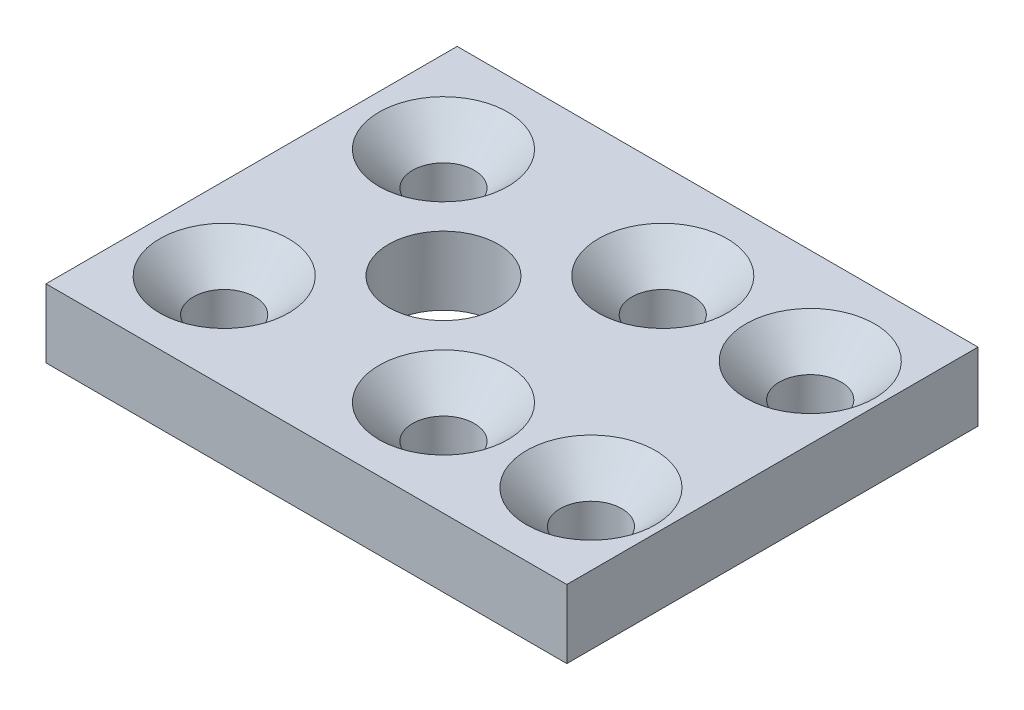
ISO-10303-21;
HEADER;
FILE_DESCRIPTION(('STEP AP214'),'2;1');
FILE_NAME('part.step','',(''),(''),'','','');
FILE_SCHEMA(('AUTOMOTIVE_DESIGN { 1 0 10303 214 1 1 1 1 }'));
ENDSEC;
DATA;
#1=APPLICATION_CONTEXT('core data for automotive mechanical design processes');
#2=APPLICATION_PROTOCOL_DEFINITION('international standard','automotive_design',2000,#1);
#3=PRODUCT_CONTEXT('',#1,'mechanical');
#4=PRODUCT('Part','Part','',(#3));
#5=PRODUCT_RELATED_PRODUCT_CATEGORY('part','',(#4));
#6=PRODUCT_DEFINITION_FORMATION('','',#4);
#7=PRODUCT_DEFINITION_CONTEXT('part definition',#1,'design');
#8=PRODUCT_DEFINITION('design','',#6,#7);
#9=PRODUCT_DEFINITION_SHAPE('','',#8);
#10=(LENGTH_UNIT() NAMED_UNIT(*) SI_UNIT(.MILLI.,.METRE.));
#11=(NAMED_UNIT(*) PLANE_ANGLE_UNIT() SI_UNIT($,.RADIAN.));
#12=(NAMED_UNIT(*) SI_UNIT($,.STERADIAN.) SOLID_ANGLE_UNIT());
#13=UNCERTAINTY_MEASURE_WITH_UNIT(LENGTH_MEASURE(1.E-05),#10,'distance_accuracy_value','');
#14=(GEOMETRIC_REPRESENTATION_CONTEXT(3) GLOBAL_UNCERTAINTY_ASSIGNED_CONTEXT((#13)) GLOBAL_UNIT_ASSIGNED_CONTEXT((#10,
#11,#12)) REPRESENTATION_CONTEXT('',''));
#15=CARTESIAN_POINT('',(0.,0.,0.));
#16=DIRECTION('',(0.,0.,1.));
#17=DIRECTION('',(1.,0.,0.));
#18=AXIS2_PLACEMENT_3D('',#15,#16,#17);
#19=CARTESIAN_POINT('',(19.,5.,15.));
#20=DIRECTION('',(-1.,0.,0.));
#21=DIRECTION('',(0.,0.,1.));
#22=AXIS2_PLACEMENT_3D('',#19,#20,#21);
#23=PLANE('',#22);
#24=DIRECTION('',(0.,0.,-1.));
#25=VECTOR('',#24,1.);
#26=CARTESIAN_POINT('',(19.,0.,15.));
#27=LINE('',#26,#25);
#28=CARTESIAN_POINT('',(19.,0.,15.));
#29=VERTEX_POINT('',#28);
#30=CARTESIAN_POINT('',(19.,0.,-15.));
#31=VERTEX_POINT('',#30);
#32=EDGE_CURVE('E95',#29,#31,#27,.T.);
#33=ORIENTED_EDGE('',*,*,#32,.T.);
#34=DIRECTION('',(0.,-1.,0.));
#35=VECTOR('',#34,1.);
#36=CARTESIAN_POINT('',(19.,5.,-15.));
#37=LINE('',#36,#35);
#38=CARTESIAN_POINT('',(19.,5.,-15.));
#39=VERTEX_POINT('',#38);
#40=EDGE_CURVE('E11',#39,#31,#37,.T.);
#41=ORIENTED_EDGE('',*,*,#40,.F.);
#42=DIRECTION('',(0.,0.,-1.));
#43=VECTOR('',#42,1.);
#44=CARTESIAN_POINT('',(19.,5.,15.));
#45=LINE('',#44,#43);
#46=CARTESIAN_POINT('',(19.,5.,15.));
#47=VERTEX_POINT('',#46);
#48=EDGE_CURVE('E83',#47,#39,#45,.T.);
#49=ORIENTED_EDGE('',*,*,#48,.F.);
#50=DIRECTION('',(0.,-1.,0.));
#51=VECTOR('',#50,1.);
#52=CARTESIAN_POINT('',(19.,5.,15.));
#53=LINE('',#52,#51);
#54=EDGE_CURVE('E91',#47,#29,#53,.T.);
#55=ORIENTED_EDGE('',*,*,#54,.T.);
#56=EDGE_LOOP('',(#33,#41,#49,#55));
#57=FACE_BOUND('',#56,.T.);
#58=ADVANCED_FACE('F32',(#57),#23,.F.);
#59=CARTESIAN_POINT('',(-19.,5.,-15.));
#60=DIRECTION('',(0.,0.,1.));
#61=DIRECTION('',(1.,0.,0.));
#62=AXIS2_PLACEMENT_3D('',#59,#60,#61);
#63=PLANE('',#62);
#64=DIRECTION('',(-1.,0.,0.));
#65=VECTOR('',#64,1.);
#66=CARTESIAN_POINT('',(-19.,0.,-15.));
#67=LINE('',#66,#65);
#68=CARTESIAN_POINT('',(-19.,0.,-15.));
#69=VERTEX_POINT('',#68);
#70=EDGE_CURVE('E87',#31,#69,#67,.T.);
#71=ORIENTED_EDGE('',*,*,#70,.T.);
#72=DIRECTION('',(0.,-1.,0.));
#73=VECTOR('',#72,1.);
#74=CARTESIAN_POINT('',(-19.,5.,-15.));
#75=LINE('',#74,#73);
#76=CARTESIAN_POINT('',(-19.,5.,-15.));
#77=VERTEX_POINT('',#76);
#78=EDGE_CURVE('E40',#77,#69,#75,.T.);
#79=ORIENTED_EDGE('',*,*,#78,.F.);
#80=DIRECTION('',(-1.,0.,0.));
#81=VECTOR('',#80,1.);
#82=CARTESIAN_POINT('',(-19.,5.,-15.));
#83=LINE('',#82,#81);
#84=EDGE_CURVE('E78',#39,#77,#83,.T.);
#85=ORIENTED_EDGE('',*,*,#84,.F.);
#86=ORIENTED_EDGE('',*,*,#40,.T.);
#87=EDGE_LOOP('',(#71,#79,#85,#86));
#88=FACE_BOUND('',#87,.T.);
#89=ADVANCED_FACE('F86',(#88),#63,.F.);
#90=CARTESIAN_POINT('',(-19.,5.,15.));
#91=DIRECTION('',(1.,0.,0.));
#92=DIRECTION('',(0.,0.,-1.));
#93=AXIS2_PLACEMENT_3D('',#90,#91,#92);
#94=PLANE('',#93);
#95=DIRECTION('',(0.,0.,1.));
#96=VECTOR('',#95,1.);
#97=CARTESIAN_POINT('',(-19.,0.,15.));
#98=LINE('',#97,#96);
#99=CARTESIAN_POINT('',(-19.,0.,15.));
#100=VERTEX_POINT('',#99);
#101=EDGE_CURVE('E65',#69,#100,#98,.T.);
#102=ORIENTED_EDGE('',*,*,#101,.T.);
#103=DIRECTION('',(0.,-1.,0.));
#104=VECTOR('',#103,1.);
#105=CARTESIAN_POINT('',(-19.,5.,15.));
#106=LINE('',#105,#104);
#107=CARTESIAN_POINT('',(-19.,5.,15.));
#108=VERTEX_POINT('',#107);
#109=EDGE_CURVE('E88',#108,#100,#106,.T.);
#110=ORIENTED_EDGE('',*,*,#109,.F.);
#111=DIRECTION('',(0.,0.,1.));
#112=VECTOR('',#111,1.);
#113=CARTESIAN_POINT('',(-19.,5.,15.));
#114=LINE('',#113,#112);
#115=EDGE_CURVE('E81',#77,#108,#114,.T.);
#116=ORIENTED_EDGE('',*,*,#115,.F.);
#117=ORIENTED_EDGE('',*,*,#78,.T.);
#118=EDGE_LOOP('',(#102,#110,#116,#117));
#119=FACE_BOUND('',#118,.T.);
#120=ADVANCED_FACE('F89',(#119),#94,.F.);
#121=CARTESIAN_POINT('',(-19.,5.,15.));
#122=DIRECTION('',(0.,0.,-1.));
#123=DIRECTION('',(-1.,0.,0.));
#124=AXIS2_PLACEMENT_3D('',#121,#122,#123);
#125=PLANE('',#124);
#126=DIRECTION('',(1.,0.,0.));
#127=VECTOR('',#126,1.);
#128=CARTESIAN_POINT('',(-19.,0.,15.));
#129=LINE('',#128,#127);
#130=EDGE_CURVE('E71',#100,#29,#129,.T.);
#131=ORIENTED_EDGE('',*,*,#130,.T.);
#132=ORIENTED_EDGE('',*,*,#54,.F.);
#133=DIRECTION('',(1.,0.,0.));
#134=VECTOR('',#133,1.);
#135=CARTESIAN_POINT('',(-19.,5.,15.));
#136=LINE('',#135,#134);
#137=EDGE_CURVE('E48',#108,#47,#136,.T.);
#138=ORIENTED_EDGE('',*,*,#137,.F.);
#139=ORIENTED_EDGE('',*,*,#109,.T.);
#140=EDGE_LOOP('',(#131,#132,#138,#139));
#141=FACE_BOUND('',#140,.T.);
#142=ADVANCED_FACE('F103',(#141),#125,.F.);
#143=CARTESIAN_POINT('',(0.,5.,0.));
#144=DIRECTION('',(0.,-1.,0.));
#145=DIRECTION('',(0.,0.,-1.));
#146=AXIS2_PLACEMENT_3D('',#143,#144,#145);
#147=PLANE('',#146);
#148=CARTESIAN_POINT('',(-5.,5.,0.));
#149=DIRECTION('',(0.,1.,0.));
#150=DIRECTION('',(0.,0.,1.));
#151=AXIS2_PLACEMENT_3D('',#148,#149,#150);
#152=CIRCLE('',#151,4.);
#153=CARTESIAN_POINT('',(-5.,5.,4.));
#154=VERTEX_POINT('',#153);
#155=EDGE_CURVE('E165',#154,#154,#152,.T.);
#156=ORIENTED_EDGE('',*,*,#155,.F.);
#157=EDGE_LOOP('',(#156));
#158=FACE_BOUND('',#157,.T.);
#159=CARTESIAN_POINT('',(-13.,5.,-8.));
#160=DIRECTION('',(0.,1.,0.));
#161=DIRECTION('',(0.,0.,1.));
#162=AXIS2_PLACEMENT_3D('',#159,#160,#161);
#163=CIRCLE('',#162,4.7);
#164=CARTESIAN_POINT('',(-13.,5.,-3.3));
#165=VERTEX_POINT('',#164);
#166=EDGE_CURVE('E159',#165,#165,#163,.T.);
#167=ORIENTED_EDGE('',*,*,#166,.F.);
#168=EDGE_LOOP('',(#167));
#169=FACE_BOUND('',#168,.T.);
#170=CARTESIAN_POINT('',(3.,5.,-8.));
#171=DIRECTION('',(0.,1.,0.));
#172=DIRECTION('',(0.,0.,1.));
#173=AXIS2_PLACEMENT_3D('',#170,#171,#172);
#174=CIRCLE('',#173,4.7);
#175=CARTESIAN_POINT('',(3.,5.,-3.3));
#176=VERTEX_POINT('',#175);
#177=EDGE_CURVE('E150',#176,#176,#174,.T.);
#178=ORIENTED_EDGE('',*,*,#177,.F.);
#179=EDGE_LOOP('',(#178));
#180=FACE_BOUND('',#179,.T.);
#181=CARTESIAN_POINT('',(3.,5.,8.));
#182=DIRECTION('',(0.,1.,0.));
#183=DIRECTION('',(0.,0.,1.));
#184=AXIS2_PLACEMENT_3D('',#181,#182,#183);
#185=CIRCLE('',#184,4.7);
#186=CARTESIAN_POINT('',(3.,5.,12.7));
#187=VERTEX_POINT('',#186);
#188=EDGE_CURVE('E141',#187,#187,#185,.T.);
#189=ORIENTED_EDGE('',*,*,#188,.F.);
#190=EDGE_LOOP('',(#189));
#191=FACE_BOUND('',#190,.T.);
#192=CARTESIAN_POINT('',(-13.,5.,8.));
#193=DIRECTION('',(0.,1.,0.));
#194=DIRECTION('',(0.,0.,1.));
#195=AXIS2_PLACEMENT_3D('',#192,#193,#194);
#196=CIRCLE('',#195,4.7);
#197=CARTESIAN_POINT('',(-13.,5.,12.7));
#198=VERTEX_POINT('',#197);
#199=EDGE_CURVE('E132',#198,#198,#196,.T.);
#200=ORIENTED_EDGE('',*,*,#199,.F.);
#201=EDGE_LOOP('',(#200));
#202=FACE_BOUND('',#201,.T.);
#203=CARTESIAN_POINT('',(13.76,5.,-8.));
#204=DIRECTION('',(0.,1.,0.));
#205=DIRECTION('',(0.,0.,1.));
#206=AXIS2_PLACEMENT_3D('',#203,#204,#205);
#207=CIRCLE('',#206,4.7);
#208=CARTESIAN_POINT('',(13.76,5.,-3.3));
#209=VERTEX_POINT('',#208);
#210=EDGE_CURVE('E123',#209,#209,#207,.T.);
#211=ORIENTED_EDGE('',*,*,#210,.F.);
#212=EDGE_LOOP('',(#211));
#213=FACE_BOUND('',#212,.T.);
#214=CARTESIAN_POINT('',(13.76,5.,8.));
#215=DIRECTION('',(0.,1.,0.));
#216=DIRECTION('',(0.,0.,1.));
#217=AXIS2_PLACEMENT_3D('',#214,#215,#216);
#218=CIRCLE('',#217,4.7);
#219=CARTESIAN_POINT('',(13.76,5.,12.7));
#220=VERTEX_POINT('',#219);
#221=EDGE_CURVE('E114',#220,#220,#218,.T.);
#222=ORIENTED_EDGE('',*,*,#221,.F.);
#223=EDGE_LOOP('',(#222));
#224=FACE_BOUND('',#223,.T.);
#225=ORIENTED_EDGE('',*,*,#48,.T.);
#226=ORIENTED_EDGE('',*,*,#84,.T.);
#227=ORIENTED_EDGE('',*,*,#115,.T.);
#228=ORIENTED_EDGE('',*,*,#137,.T.);
#229=EDGE_LOOP('',(#225,#226,#227,#228));
#230=FACE_BOUND('',#229,.T.);
#231=ADVANCED_FACE('F79',(#158,#169,#180,#191,#202,#213,#224,#230),#147,.F.);
#232=CARTESIAN_POINT('',(0.,0.,0.));
#233=DIRECTION('',(0.,-1.,0.));
#234=DIRECTION('',(0.,0.,-1.));
#235=AXIS2_PLACEMENT_3D('',#232,#233,#234);
#236=PLANE('',#235);
#237=CARTESIAN_POINT('',(-5.,0.,0.));
#238=DIRECTION('',(0.,-1.,0.));
#239=DIRECTION('',(0.,0.,-1.));
#240=AXIS2_PLACEMENT_3D('',#237,#238,#239);
#241=CIRCLE('',#240,4.);
#242=CARTESIAN_POINT('',(-5.,0.,-4.));
#243=VERTEX_POINT('',#242);
#244=EDGE_CURVE('E162',#243,#243,#241,.T.);
#245=ORIENTED_EDGE('',*,*,#244,.F.);
#246=EDGE_LOOP('',(#245));
#247=FACE_BOUND('',#246,.T.);
#248=CARTESIAN_POINT('',(-13.,0.,-8.));
#249=DIRECTION('',(0.,-1.,0.));
#250=DIRECTION('',(0.,0.,-1.));
#251=AXIS2_PLACEMENT_3D('',#248,#249,#250);
#252=CIRCLE('',#251,2.25);
#253=CARTESIAN_POINT('',(-13.,0.,-10.25));
#254=VERTEX_POINT('',#253);
#255=EDGE_CURVE('E153',#254,#254,#252,.T.);
#256=ORIENTED_EDGE('',*,*,#255,.F.);
#257=EDGE_LOOP('',(#256));
#258=FACE_BOUND('',#257,.T.);
#259=CARTESIAN_POINT('',(3.,0.,-8.));
#260=DIRECTION('',(0.,-1.,0.));
#261=DIRECTION('',(0.,0.,-1.));
#262=AXIS2_PLACEMENT_3D('',#259,#260,#261);
#263=CIRCLE('',#262,2.25);
#264=CARTESIAN_POINT('',(3.,0.,-10.25));
#265=VERTEX_POINT('',#264);
#266=EDGE_CURVE('E144',#265,#265,#263,.T.);
#267=ORIENTED_EDGE('',*,*,#266,.F.);
#268=EDGE_LOOP('',(#267));
#269=FACE_BOUND('',#268,.T.);
#270=CARTESIAN_POINT('',(3.,0.,8.));
#271=DIRECTION('',(0.,-1.,0.));
#272=DIRECTION('',(0.,0.,-1.));
#273=AXIS2_PLACEMENT_3D('',#270,#271,#272);
#274=CIRCLE('',#273,2.25);
#275=CARTESIAN_POINT('',(3.,0.,5.75));
#276=VERTEX_POINT('',#275);
#277=EDGE_CURVE('E135',#276,#276,#274,.T.);
#278=ORIENTED_EDGE('',*,*,#277,.F.);
#279=EDGE_LOOP('',(#278));
#280=FACE_BOUND('',#279,.T.);
#281=CARTESIAN_POINT('',(-13.,0.,8.));
#282=DIRECTION('',(0.,-1.,0.));
#283=DIRECTION('',(0.,0.,-1.));
#284=AXIS2_PLACEMENT_3D('',#281,#282,#283);
#285=CIRCLE('',#284,2.25);
#286=CARTESIAN_POINT('',(-13.,0.,5.75));
#287=VERTEX_POINT('',#286);
#288=EDGE_CURVE('E126',#287,#287,#285,.T.);
#289=ORIENTED_EDGE('',*,*,#288,.F.);
#290=EDGE_LOOP('',(#289));
#291=FACE_BOUND('',#290,.T.);
#292=CARTESIAN_POINT('',(13.76,0.,-8.));
#293=DIRECTION('',(0.,-1.,0.));
#294=DIRECTION('',(0.,0.,-1.));
#295=AXIS2_PLACEMENT_3D('',#292,#293,#294);
#296=CIRCLE('',#295,2.25);
#297=CARTESIAN_POINT('',(13.76,0.,-10.25));
#298=VERTEX_POINT('',#297);
#299=EDGE_CURVE('E117',#298,#298,#296,.T.);
#300=ORIENTED_EDGE('',*,*,#299,.F.);
#301=EDGE_LOOP('',(#300));
#302=FACE_BOUND('',#301,.T.);
#303=CARTESIAN_POINT('',(13.76,0.,8.));
#304=DIRECTION('',(0.,-1.,0.));
#305=DIRECTION('',(0.,0.,-1.));
#306=AXIS2_PLACEMENT_3D('',#303,#304,#305);
#307=CIRCLE('',#306,2.25);
#308=CARTESIAN_POINT('',(13.76,0.,5.75));
#309=VERTEX_POINT('',#308);
#310=EDGE_CURVE('E98',#309,#309,#307,.T.);
#311=ORIENTED_EDGE('',*,*,#310,.F.);
#312=EDGE_LOOP('',(#311));
#313=FACE_BOUND('',#312,.T.);
#314=ORIENTED_EDGE('',*,*,#32,.F.);
#315=ORIENTED_EDGE('',*,*,#130,.F.);
#316=ORIENTED_EDGE('',*,*,#101,.F.);
#317=ORIENTED_EDGE('',*,*,#70,.F.);
#318=EDGE_LOOP('',(#314,#315,#316,#317));
#319=FACE_BOUND('',#318,.T.);
#320=ADVANCED_FACE('F106',(#247,#258,#269,#280,#291,#302,#313,#319),#236,.T.);
#321=CARTESIAN_POINT('',(13.76,5.,8.));
#322=DIRECTION('',(0.,1.,0.));
#323=DIRECTION('',(0.,0.,1.));
#324=AXIS2_PLACEMENT_3D('',#321,#322,#323);
#325=CYLINDRICAL_SURFACE('',#324,2.25);
#326=CARTESIAN_POINT('',(13.76,2.55,8.));
#327=DIRECTION('',(0.,1.,0.));
#328=DIRECTION('',(0.,0.,1.));
#329=AXIS2_PLACEMENT_3D('',#326,#327,#328);
#330=CIRCLE('',#329,2.25);
#331=CARTESIAN_POINT('',(13.76,2.55,10.25));
#332=VERTEX_POINT('',#331);
#333=EDGE_CURVE('E111',#332,#332,#330,.T.);
#334=ORIENTED_EDGE('',*,*,#333,.T.);
#335=EDGE_LOOP('',(#334));
#336=FACE_BOUND('',#335,.T.);
#337=ORIENTED_EDGE('',*,*,#310,.T.);
#338=EDGE_LOOP('',(#337));
#339=FACE_BOUND('',#338,.T.);
#340=ADVANCED_FACE('F190',(#336,#339),#325,.F.);
#341=CARTESIAN_POINT('',(13.76,5.,8.));
#342=DIRECTION('',(0.,1.,0.));
#343=DIRECTION('',(0.,0.,1.));
#344=AXIS2_PLACEMENT_3D('',#341,#342,#343);
#345=CONICAL_SURFACE('',#344,4.7,0.785398163397448);
#346=ORIENTED_EDGE('',*,*,#333,.F.);
#347=EDGE_LOOP('',(#346));
#348=FACE_BOUND('',#347,.T.);
#349=ORIENTED_EDGE('',*,*,#221,.T.);
#350=EDGE_LOOP('',(#349));
#351=FACE_BOUND('',#350,.T.);
#352=ADVANCED_FACE('F187',(#348,#351),#345,.F.);
#353=CARTESIAN_POINT('',(13.76,5.,-8.));
#354=DIRECTION('',(0.,1.,0.));
#355=DIRECTION('',(0.,0.,1.));
#356=AXIS2_PLACEMENT_3D('',#353,#354,#355);
#357=CYLINDRICAL_SURFACE('',#356,2.25);
#358=CARTESIAN_POINT('',(13.76,2.55,-8.));
#359=DIRECTION('',(0.,1.,0.));
#360=DIRECTION('',(0.,0.,1.));
#361=AXIS2_PLACEMENT_3D('',#358,#359,#360);
#362=CIRCLE('',#361,2.25);
#363=CARTESIAN_POINT('',(13.76,2.55,-5.75));
#364=VERTEX_POINT('',#363);
#365=EDGE_CURVE('E120',#364,#364,#362,.T.);
#366=ORIENTED_EDGE('',*,*,#365,.T.);
#367=EDGE_LOOP('',(#366));
#368=FACE_BOUND('',#367,.T.);
#369=ORIENTED_EDGE('',*,*,#299,.T.);
#370=EDGE_LOOP('',(#369));
#371=FACE_BOUND('',#370,.T.);
#372=ADVANCED_FACE('F189',(#368,#371),#357,.F.);
#373=CARTESIAN_POINT('',(13.76,5.,-8.));
#374=DIRECTION('',(0.,1.,0.));
#375=DIRECTION('',(0.,0.,1.));
#376=AXIS2_PLACEMENT_3D('',#373,#374,#375);
#377=CONICAL_SURFACE('',#376,4.7,0.785398163397448);
#378=ORIENTED_EDGE('',*,*,#365,.F.);
#379=EDGE_LOOP('',(#378));
#380=FACE_BOUND('',#379,.T.);
#381=ORIENTED_EDGE('',*,*,#210,.T.);
#382=EDGE_LOOP('',(#381));
#383=FACE_BOUND('',#382,.T.);
#384=ADVANCED_FACE('F197',(#380,#383),#377,.F.);
#385=CARTESIAN_POINT('',(-13.,5.,8.));
#386=DIRECTION('',(0.,1.,0.));
#387=DIRECTION('',(0.,0.,1.));
#388=AXIS2_PLACEMENT_3D('',#385,#386,#387);
#389=CYLINDRICAL_SURFACE('',#388,2.25);
#390=CARTESIAN_POINT('',(-13.,2.55,8.));
#391=DIRECTION('',(0.,1.,0.));
#392=DIRECTION('',(0.,0.,1.));
#393=AXIS2_PLACEMENT_3D('',#390,#391,#392);
#394=CIRCLE('',#393,2.25);
#395=CARTESIAN_POINT('',(-13.,2.55,10.25));
#396=VERTEX_POINT('',#395);
#397=EDGE_CURVE('E129',#396,#396,#394,.T.);
#398=ORIENTED_EDGE('',*,*,#397,.T.);
#399=EDGE_LOOP('',(#398));
#400=FACE_BOUND('',#399,.T.);
#401=ORIENTED_EDGE('',*,*,#288,.T.);
#402=EDGE_LOOP('',(#401));
#403=FACE_BOUND('',#402,.T.);
#404=ADVANCED_FACE('F234',(#400,#403),#389,.F.);
#405=CARTESIAN_POINT('',(-13.,5.,8.));
#406=DIRECTION('',(0.,1.,0.));
#407=DIRECTION('',(0.,0.,1.));
#408=AXIS2_PLACEMENT_3D('',#405,#406,#407);
#409=CONICAL_SURFACE('',#408,4.7,0.785398163397448);
#410=ORIENTED_EDGE('',*,*,#397,.F.);
#411=EDGE_LOOP('',(#410));
#412=FACE_BOUND('',#411,.T.);
#413=ORIENTED_EDGE('',*,*,#199,.T.);
#414=EDGE_LOOP('',(#413));
#415=FACE_BOUND('',#414,.T.);
#416=ADVANCED_FACE('F236',(#412,#415),#409,.F.);
#417=CARTESIAN_POINT('',(3.,5.,8.));
#418=DIRECTION('',(0.,1.,0.));
#419=DIRECTION('',(0.,0.,1.));
#420=AXIS2_PLACEMENT_3D('',#417,#418,#419);
#421=CYLINDRICAL_SURFACE('',#420,2.25);
#422=CARTESIAN_POINT('',(3.,2.55,8.));
#423=DIRECTION('',(0.,1.,0.));
#424=DIRECTION('',(0.,0.,1.));
#425=AXIS2_PLACEMENT_3D('',#422,#423,#424);
#426=CIRCLE('',#425,2.25);
#427=CARTESIAN_POINT('',(3.,2.55,10.25));
#428=VERTEX_POINT('',#427);
#429=EDGE_CURVE('E138',#428,#428,#426,.T.);
#430=ORIENTED_EDGE('',*,*,#429,.T.);
#431=EDGE_LOOP('',(#430));
#432=FACE_BOUND('',#431,.T.);
#433=ORIENTED_EDGE('',*,*,#277,.T.);
#434=EDGE_LOOP('',(#433));
#435=FACE_BOUND('',#434,.T.);
#436=ADVANCED_FACE('F243',(#432,#435),#421,.F.);
#437=CARTESIAN_POINT('',(3.,5.,8.));
#438=DIRECTION('',(0.,1.,0.));
#439=DIRECTION('',(0.,0.,1.));
#440=AXIS2_PLACEMENT_3D('',#437,#438,#439);
#441=CONICAL_SURFACE('',#440,4.7,0.785398163397448);
#442=ORIENTED_EDGE('',*,*,#429,.F.);
#443=EDGE_LOOP('',(#442));
#444=FACE_BOUND('',#443,.T.);
#445=ORIENTED_EDGE('',*,*,#188,.T.);
#446=EDGE_LOOP('',(#445));
#447=FACE_BOUND('',#446,.T.);
#448=ADVANCED_FACE('F251',(#444,#447),#441,.F.);
#449=CARTESIAN_POINT('',(3.,5.,-8.));
#450=DIRECTION('',(0.,1.,0.));
#451=DIRECTION('',(0.,0.,1.));
#452=AXIS2_PLACEMENT_3D('',#449,#450,#451);
#453=CYLINDRICAL_SURFACE('',#452,2.25);
#454=CARTESIAN_POINT('',(3.,2.55,-8.));
#455=DIRECTION('',(0.,1.,0.));
#456=DIRECTION('',(0.,0.,1.));
#457=AXIS2_PLACEMENT_3D('',#454,#455,#456);
#458=CIRCLE('',#457,2.25);
#459=CARTESIAN_POINT('',(3.,2.55,-5.75));
#460=VERTEX_POINT('',#459);
#461=EDGE_CURVE('E147',#460,#460,#458,.T.);
#462=ORIENTED_EDGE('',*,*,#461,.T.);
#463=EDGE_LOOP('',(#462));
#464=FACE_BOUND('',#463,.T.);
#465=ORIENTED_EDGE('',*,*,#266,.T.);
#466=EDGE_LOOP('',(#465));
#467=FACE_BOUND('',#466,.T.);
#468=ADVANCED_FACE('F255',(#464,#467),#453,.F.);
#469=CARTESIAN_POINT('',(3.,5.,-8.));
#470=DIRECTION('',(0.,1.,0.));
#471=DIRECTION('',(0.,0.,1.));
#472=AXIS2_PLACEMENT_3D('',#469,#470,#471);
#473=CONICAL_SURFACE('',#472,4.7,0.785398163397448);
#474=ORIENTED_EDGE('',*,*,#461,.F.);
#475=EDGE_LOOP('',(#474));
#476=FACE_BOUND('',#475,.T.);
#477=ORIENTED_EDGE('',*,*,#177,.T.);
#478=EDGE_LOOP('',(#477));
#479=FACE_BOUND('',#478,.T.);
#480=ADVANCED_FACE('F259',(#476,#479),#473,.F.);
#481=CARTESIAN_POINT('',(-13.,5.,-8.));
#482=DIRECTION('',(0.,1.,0.));
#483=DIRECTION('',(0.,0.,1.));
#484=AXIS2_PLACEMENT_3D('',#481,#482,#483);
#485=CYLINDRICAL_SURFACE('',#484,2.25);
#486=CARTESIAN_POINT('',(-13.,2.55,-8.));
#487=DIRECTION('',(0.,1.,0.));
#488=DIRECTION('',(0.,0.,1.));
#489=AXIS2_PLACEMENT_3D('',#486,#487,#488);
#490=CIRCLE('',#489,2.25);
#491=CARTESIAN_POINT('',(-13.,2.55,-5.75));
#492=VERTEX_POINT('',#491);
#493=EDGE_CURVE('E156',#492,#492,#490,.T.);
#494=ORIENTED_EDGE('',*,*,#493,.T.);
#495=EDGE_LOOP('',(#494));
#496=FACE_BOUND('',#495,.T.);
#497=ORIENTED_EDGE('',*,*,#255,.T.);
#498=EDGE_LOOP('',(#497));
#499=FACE_BOUND('',#498,.T.);
#500=ADVANCED_FACE('F263',(#496,#499),#485,.F.);
#501=CARTESIAN_POINT('',(-13.,5.,-8.));
#502=DIRECTION('',(0.,1.,0.));
#503=DIRECTION('',(0.,0.,1.));
#504=AXIS2_PLACEMENT_3D('',#501,#502,#503);
#505=CONICAL_SURFACE('',#504,4.7,0.785398163397448);
#506=ORIENTED_EDGE('',*,*,#493,.F.);
#507=EDGE_LOOP('',(#506));
#508=FACE_BOUND('',#507,.T.);
#509=ORIENTED_EDGE('',*,*,#166,.T.);
#510=EDGE_LOOP('',(#509));
#511=FACE_BOUND('',#510,.T.);
#512=ADVANCED_FACE('F267',(#508,#511),#505,.F.);
#513=CARTESIAN_POINT('',(-5.,5.,0.));
#514=DIRECTION('',(0.,1.,0.));
#515=DIRECTION('',(0.,0.,1.));
#516=AXIS2_PLACEMENT_3D('',#513,#514,#515);
#517=CYLINDRICAL_SURFACE('',#516,4.);
#518=ORIENTED_EDGE('',*,*,#155,.T.);
#519=EDGE_LOOP('',(#518));
#520=FACE_BOUND('',#519,.T.);
#521=ORIENTED_EDGE('',*,*,#244,.T.);
#522=EDGE_LOOP('',(#521));
#523=FACE_BOUND('',#522,.T.);
#524=ADVANCED_FACE('F169',(#520,#523),#517,.F.);
#525=CLOSED_SHELL('',(#58,#89,#120,#142,#231,#320,#340,#352,#372,#384,#404,#416,#436,#448,#468,
#480,#500,#512,#524));
#526=MANIFOLD_SOLID_BREP('B2',#525);
#527=ADVANCED_BREP_SHAPE_REPRESENTATION('',(#18,#526),#14);
#528=SHAPE_DEFINITION_REPRESENTATION(#9,#527);
ENDSEC;
END-ISO-10303-21;
